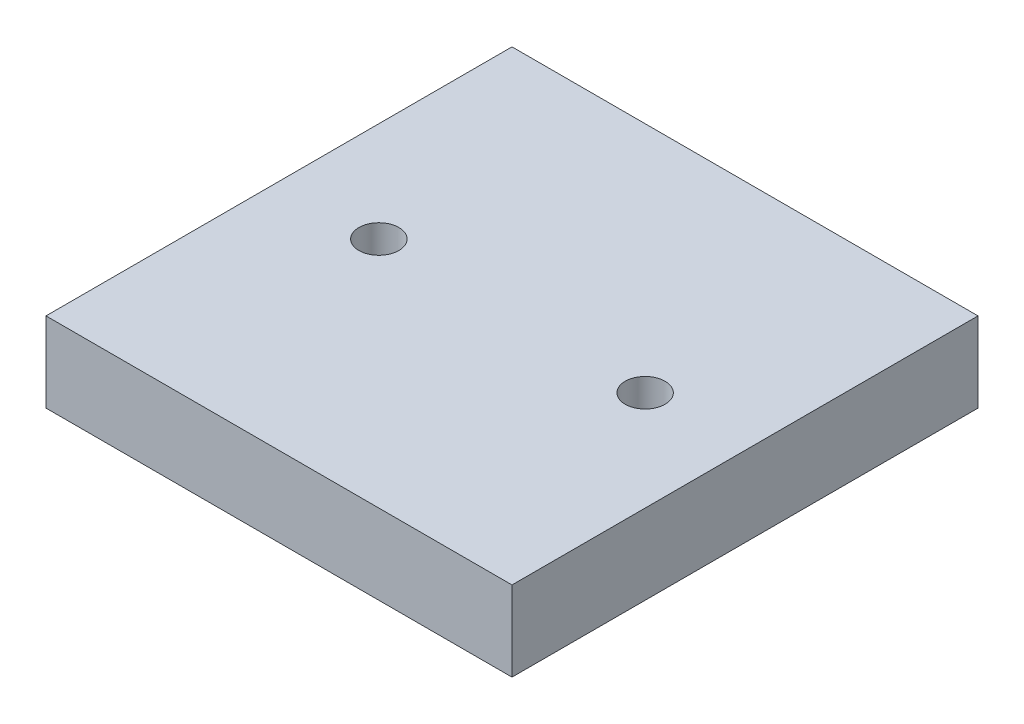
ISO-10303-21;
HEADER;
FILE_DESCRIPTION(('STEP AP214'),'2;1');
FILE_NAME('part.step','',(''),(''),'','','');
FILE_SCHEMA(('AUTOMOTIVE_DESIGN { 1 0 10303 214 1 1 1 1 }'));
ENDSEC;
DATA;
#1=APPLICATION_CONTEXT('core data for automotive mechanical design processes');
#2=APPLICATION_PROTOCOL_DEFINITION('international standard','automotive_design',2000,#1);
#3=PRODUCT_CONTEXT('',#1,'mechanical');
#4=PRODUCT('Part','Part','',(#3));
#5=PRODUCT_RELATED_PRODUCT_CATEGORY('part','',(#4));
#6=PRODUCT_DEFINITION_FORMATION('','',#4);
#7=PRODUCT_DEFINITION_CONTEXT('part definition',#1,'design');
#8=PRODUCT_DEFINITION('design','',#6,#7);
#9=PRODUCT_DEFINITION_SHAPE('','',#8);
#10=(LENGTH_UNIT() NAMED_UNIT(*) SI_UNIT(.MILLI.,.METRE.));
#11=(NAMED_UNIT(*) PLANE_ANGLE_UNIT() SI_UNIT($,.RADIAN.));
#12=(NAMED_UNIT(*) SI_UNIT($,.STERADIAN.) SOLID_ANGLE_UNIT());
#13=UNCERTAINTY_MEASURE_WITH_UNIT(LENGTH_MEASURE(1.E-05),#10,'distance_accuracy_value','');
#14=(GEOMETRIC_REPRESENTATION_CONTEXT(3) GLOBAL_UNCERTAINTY_ASSIGNED_CONTEXT((#13)) GLOBAL_UNIT_ASSIGNED_CONTEXT((#10,
#11,#12)) REPRESENTATION_CONTEXT('',''));
#15=CARTESIAN_POINT('',(0.,0.,0.));
#16=DIRECTION('',(0.,0.,1.));
#17=DIRECTION('',(1.,0.,0.));
#18=AXIS2_PLACEMENT_3D('',#15,#16,#17);
#19=CARTESIAN_POINT('',(35.,12.,-35.));
#20=DIRECTION('',(0.,-1.,0.));
#21=DIRECTION('',(0.,0.,-1.));
#22=AXIS2_PLACEMENT_3D('',#19,#20,#21);
#23=PLANE('',#22);
#24=CARTESIAN_POINT('',(-20.,12.,0.));
#25=DIRECTION('',(0.,1.,0.));
#26=DIRECTION('',(0.,0.,1.));
#27=AXIS2_PLACEMENT_3D('',#24,#25,#26);
#28=CIRCLE('',#27,3.);
#29=CARTESIAN_POINT('',(-20.,12.,3.));
#30=VERTEX_POINT('',#29);
#31=EDGE_CURVE('E99',#30,#30,#28,.T.);
#32=ORIENTED_EDGE('',*,*,#31,.F.);
#33=EDGE_LOOP('',(#32));
#34=FACE_BOUND('',#33,.T.);
#35=DIRECTION('',(0.,0.,-1.));
#36=VECTOR('',#35,1.);
#37=CARTESIAN_POINT('',(35.,12.,35.));
#38=LINE('',#37,#36);
#39=CARTESIAN_POINT('',(35.,12.,35.));
#40=VERTEX_POINT('',#39);
#41=CARTESIAN_POINT('',(35.,12.,-35.));
#42=VERTEX_POINT('',#41);
#43=EDGE_CURVE('E84',#40,#42,#38,.T.);
#44=ORIENTED_EDGE('',*,*,#43,.T.);
#45=DIRECTION('',(-1.,0.,0.));
#46=VECTOR('',#45,1.);
#47=CARTESIAN_POINT('',(-35.,12.,-35.));
#48=LINE('',#47,#46);
#49=CARTESIAN_POINT('',(-35.,12.,-35.));
#50=VERTEX_POINT('',#49);
#51=EDGE_CURVE('E79',#42,#50,#48,.T.);
#52=ORIENTED_EDGE('',*,*,#51,.T.);
#53=DIRECTION('',(0.,0.,1.));
#54=VECTOR('',#53,1.);
#55=CARTESIAN_POINT('',(-35.,12.,35.));
#56=LINE('',#55,#54);
#57=CARTESIAN_POINT('',(-35.,12.,35.));
#58=VERTEX_POINT('',#57);
#59=EDGE_CURVE('E82',#50,#58,#56,.T.);
#60=ORIENTED_EDGE('',*,*,#59,.T.);
#61=DIRECTION('',(1.,0.,0.));
#62=VECTOR('',#61,1.);
#63=CARTESIAN_POINT('',(-35.,12.,35.));
#64=LINE('',#63,#62);
#65=EDGE_CURVE('E49',#58,#40,#64,.T.);
#66=ORIENTED_EDGE('',*,*,#65,.T.);
#67=EDGE_LOOP('',(#44,#52,#60,#66));
#68=FACE_BOUND('',#67,.T.);
#69=CARTESIAN_POINT('',(20.,12.,0.));
#70=DIRECTION('',(0.,1.,0.));
#71=DIRECTION('',(0.,0.,1.));
#72=AXIS2_PLACEMENT_3D('',#69,#70,#71);
#73=CIRCLE('',#72,3.);
#74=CARTESIAN_POINT('',(20.,12.,3.));
#75=VERTEX_POINT('',#74);
#76=EDGE_CURVE('E114',#75,#75,#73,.T.);
#77=ORIENTED_EDGE('',*,*,#76,.F.);
#78=EDGE_LOOP('',(#77));
#79=FACE_BOUND('',#78,.T.);
#80=ADVANCED_FACE('F32',(#34,#68,#79),#23,.F.);
#81=CARTESIAN_POINT('',(35.,0.,-35.));
#82=DIRECTION('',(0.,-1.,0.));
#83=DIRECTION('',(0.,0.,-1.));
#84=AXIS2_PLACEMENT_3D('',#81,#82,#83);
#85=PLANE('',#84);
#86=CARTESIAN_POINT('',(-20.,0.,0.));
#87=DIRECTION('',(0.,1.,0.));
#88=DIRECTION('',(0.,0.,1.));
#89=AXIS2_PLACEMENT_3D('',#86,#87,#88);
#90=CIRCLE('',#89,3.);
#91=CARTESIAN_POINT('',(-20.,0.,3.));
#92=VERTEX_POINT('',#91);
#93=EDGE_CURVE('E111',#92,#92,#90,.T.);
#94=ORIENTED_EDGE('',*,*,#93,.T.);
#95=EDGE_LOOP('',(#94));
#96=FACE_BOUND('',#95,.T.);
#97=DIRECTION('',(0.,0.,-1.));
#98=VECTOR('',#97,1.);
#99=CARTESIAN_POINT('',(35.,0.,35.));
#100=LINE('',#99,#98);
#101=CARTESIAN_POINT('',(35.,0.,35.));
#102=VERTEX_POINT('',#101);
#103=CARTESIAN_POINT('',(35.,0.,-35.));
#104=VERTEX_POINT('',#103);
#105=EDGE_CURVE('E96',#102,#104,#100,.T.);
#106=ORIENTED_EDGE('',*,*,#105,.F.);
#107=DIRECTION('',(1.,0.,0.));
#108=VECTOR('',#107,1.);
#109=CARTESIAN_POINT('',(-35.,0.,35.));
#110=LINE('',#109,#108);
#111=CARTESIAN_POINT('',(-35.,0.,35.));
#112=VERTEX_POINT('',#111);
#113=EDGE_CURVE('E72',#112,#102,#110,.T.);
#114=ORIENTED_EDGE('',*,*,#113,.F.);
#115=DIRECTION('',(0.,0.,1.));
#116=VECTOR('',#115,1.);
#117=CARTESIAN_POINT('',(-35.,0.,35.));
#118=LINE('',#117,#116);
#119=CARTESIAN_POINT('',(-35.,0.,-35.));
#120=VERTEX_POINT('',#119);
#121=EDGE_CURVE('E66',#120,#112,#118,.T.);
#122=ORIENTED_EDGE('',*,*,#121,.F.);
#123=DIRECTION('',(-1.,0.,0.));
#124=VECTOR('',#123,1.);
#125=CARTESIAN_POINT('',(-35.,0.,-35.));
#126=LINE('',#125,#124);
#127=EDGE_CURVE('E88',#104,#120,#126,.T.);
#128=ORIENTED_EDGE('',*,*,#127,.F.);
#129=EDGE_LOOP('',(#106,#114,#122,#128));
#130=FACE_BOUND('',#129,.T.);
#131=CARTESIAN_POINT('',(20.,0.,0.));
#132=DIRECTION('',(0.,1.,0.));
#133=DIRECTION('',(0.,0.,1.));
#134=AXIS2_PLACEMENT_3D('',#131,#132,#133);
#135=CIRCLE('',#134,3.);
#136=CARTESIAN_POINT('',(20.,0.,3.));
#137=VERTEX_POINT('',#136);
#138=EDGE_CURVE('E117',#137,#137,#135,.T.);
#139=ORIENTED_EDGE('',*,*,#138,.T.);
#140=EDGE_LOOP('',(#139));
#141=FACE_BOUND('',#140,.T.);
#142=ADVANCED_FACE('F107',(#96,#130,#141),#85,.T.);
#143=CARTESIAN_POINT('',(35.,12.,35.));
#144=DIRECTION('',(-1.,0.,0.));
#145=DIRECTION('',(0.,0.,1.));
#146=AXIS2_PLACEMENT_3D('',#143,#144,#145);
#147=PLANE('',#146);
#148=ORIENTED_EDGE('',*,*,#105,.T.);
#149=DIRECTION('',(0.,-1.,0.));
#150=VECTOR('',#149,1.);
#151=CARTESIAN_POINT('',(35.,12.,-35.));
#152=LINE('',#151,#150);
#153=EDGE_CURVE('E11',#42,#104,#152,.T.);
#154=ORIENTED_EDGE('',*,*,#153,.F.);
#155=ORIENTED_EDGE('',*,*,#43,.F.);
#156=DIRECTION('',(0.,-1.,0.));
#157=VECTOR('',#156,1.);
#158=CARTESIAN_POINT('',(35.,12.,35.));
#159=LINE('',#158,#157);
#160=EDGE_CURVE('E92',#40,#102,#159,.T.);
#161=ORIENTED_EDGE('',*,*,#160,.T.);
#162=EDGE_LOOP('',(#148,#154,#155,#161));
#163=FACE_BOUND('',#162,.T.);
#164=ADVANCED_FACE('F34',(#163),#147,.F.);
#165=CARTESIAN_POINT('',(-35.,12.,-35.));
#166=DIRECTION('',(0.,0.,1.));
#167=DIRECTION('',(1.,0.,0.));
#168=AXIS2_PLACEMENT_3D('',#165,#166,#167);
#169=PLANE('',#168);
#170=ORIENTED_EDGE('',*,*,#127,.T.);
#171=DIRECTION('',(0.,-1.,0.));
#172=VECTOR('',#171,1.);
#173=CARTESIAN_POINT('',(-35.,12.,-35.));
#174=LINE('',#173,#172);
#175=EDGE_CURVE('E41',#50,#120,#174,.T.);
#176=ORIENTED_EDGE('',*,*,#175,.F.);
#177=ORIENTED_EDGE('',*,*,#51,.F.);
#178=ORIENTED_EDGE('',*,*,#153,.T.);
#179=EDGE_LOOP('',(#170,#176,#177,#178));
#180=FACE_BOUND('',#179,.T.);
#181=ADVANCED_FACE('F87',(#180),#169,.F.);
#182=CARTESIAN_POINT('',(-35.,12.,35.));
#183=DIRECTION('',(1.,0.,0.));
#184=DIRECTION('',(0.,0.,-1.));
#185=AXIS2_PLACEMENT_3D('',#182,#183,#184);
#186=PLANE('',#185);
#187=ORIENTED_EDGE('',*,*,#121,.T.);
#188=DIRECTION('',(0.,-1.,0.));
#189=VECTOR('',#188,1.);
#190=CARTESIAN_POINT('',(-35.,12.,35.));
#191=LINE('',#190,#189);
#192=EDGE_CURVE('E89',#58,#112,#191,.T.);
#193=ORIENTED_EDGE('',*,*,#192,.F.);
#194=ORIENTED_EDGE('',*,*,#59,.F.);
#195=ORIENTED_EDGE('',*,*,#175,.T.);
#196=EDGE_LOOP('',(#187,#193,#194,#195));
#197=FACE_BOUND('',#196,.T.);
#198=ADVANCED_FACE('F90',(#197),#186,.F.);
#199=CARTESIAN_POINT('',(-35.,12.,35.));
#200=DIRECTION('',(0.,0.,-1.));
#201=DIRECTION('',(-1.,0.,0.));
#202=AXIS2_PLACEMENT_3D('',#199,#200,#201);
#203=PLANE('',#202);
#204=ORIENTED_EDGE('',*,*,#113,.T.);
#205=ORIENTED_EDGE('',*,*,#160,.F.);
#206=ORIENTED_EDGE('',*,*,#65,.F.);
#207=ORIENTED_EDGE('',*,*,#192,.T.);
#208=EDGE_LOOP('',(#204,#205,#206,#207));
#209=FACE_BOUND('',#208,.T.);
#210=ADVANCED_FACE('F104',(#209),#203,.F.);
#211=CARTESIAN_POINT('',(-20.,12.,0.));
#212=DIRECTION('',(0.,-1.,0.));
#213=DIRECTION('',(0.,0.,-1.));
#214=AXIS2_PLACEMENT_3D('',#211,#212,#213);
#215=CYLINDRICAL_SURFACE('',#214,3.);
#216=ORIENTED_EDGE('',*,*,#31,.T.);
#217=EDGE_LOOP('',(#216));
#218=FACE_BOUND('',#217,.T.);
#219=ORIENTED_EDGE('',*,*,#93,.F.);
#220=EDGE_LOOP('',(#219));
#221=FACE_BOUND('',#220,.T.);
#222=ADVANCED_FACE('F135',(#218,#221),#215,.F.);
#223=CARTESIAN_POINT('',(20.,12.,0.));
#224=DIRECTION('',(0.,-1.,0.));
#225=DIRECTION('',(0.,0.,-1.));
#226=AXIS2_PLACEMENT_3D('',#223,#224,#225);
#227=CYLINDRICAL_SURFACE('',#226,3.);
#228=ORIENTED_EDGE('',*,*,#76,.T.);
#229=EDGE_LOOP('',(#228));
#230=FACE_BOUND('',#229,.T.);
#231=ORIENTED_EDGE('',*,*,#138,.F.);
#232=EDGE_LOOP('',(#231));
#233=FACE_BOUND('',#232,.T.);
#234=ADVANCED_FACE('F123',(#230,#233),#227,.F.);
#235=CLOSED_SHELL('',(#80,#142,#164,#181,#198,#210,#222,#234));
#236=MANIFOLD_SOLID_BREP('B2',#235);
#237=ADVANCED_BREP_SHAPE_REPRESENTATION('',(#18,#236),#14);
#238=SHAPE_DEFINITION_REPRESENTATION(#9,#237);
ENDSEC;
END-ISO-10303-21;
